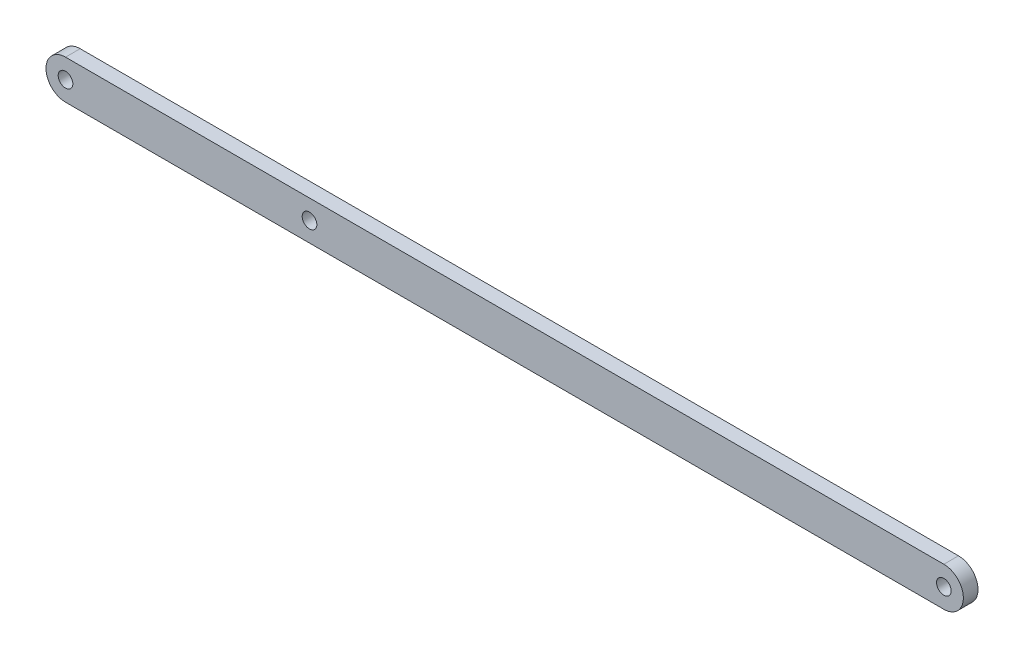
ISO-10303-21;
HEADER;
FILE_DESCRIPTION(('STEP AP214'),'2;1');
FILE_NAME('part.step','',(''),(''),'','','');
FILE_SCHEMA(('AUTOMOTIVE_DESIGN { 1 0 10303 214 1 1 1 1 }'));
ENDSEC;
DATA;
#1=APPLICATION_CONTEXT('core data for automotive mechanical design processes');
#2=APPLICATION_PROTOCOL_DEFINITION('international standard','automotive_design',2000,#1);
#3=PRODUCT_CONTEXT('',#1,'mechanical');
#4=PRODUCT('Part','Part','',(#3));
#5=PRODUCT_RELATED_PRODUCT_CATEGORY('part','',(#4));
#6=PRODUCT_DEFINITION_FORMATION('','',#4);
#7=PRODUCT_DEFINITION_CONTEXT('part definition',#1,'design');
#8=PRODUCT_DEFINITION('design','',#6,#7);
#9=PRODUCT_DEFINITION_SHAPE('','',#8);
#10=(LENGTH_UNIT() NAMED_UNIT(*) SI_UNIT(.MILLI.,.METRE.));
#11=(NAMED_UNIT(*) PLANE_ANGLE_UNIT() SI_UNIT($,.RADIAN.));
#12=(NAMED_UNIT(*) SI_UNIT($,.STERADIAN.) SOLID_ANGLE_UNIT());
#13=UNCERTAINTY_MEASURE_WITH_UNIT(LENGTH_MEASURE(1.E-05),#10,'distance_accuracy_value','');
#14=(GEOMETRIC_REPRESENTATION_CONTEXT(3) GLOBAL_UNCERTAINTY_ASSIGNED_CONTEXT((#13)) GLOBAL_UNIT_ASSIGNED_CONTEXT((#10,
#11,#12)) REPRESENTATION_CONTEXT('',''));
#15=CARTESIAN_POINT('',(0.,0.,0.));
#16=DIRECTION('',(0.,0.,1.));
#17=DIRECTION('',(1.,0.,0.));
#18=AXIS2_PLACEMENT_3D('',#15,#16,#17);
#19=CARTESIAN_POINT('',(-89.8075344843675,0.,-4.5));
#20=DIRECTION('',(0.,0.,1.));
#21=DIRECTION('',(1.,0.,0.));
#22=AXIS2_PLACEMENT_3D('',#19,#20,#21);
#23=CYLINDRICAL_SURFACE('',#22,4.);
#24=CARTESIAN_POINT('',(-89.8075344843675,0.,-1.5));
#25=DIRECTION('',(0.,0.,1.));
#26=DIRECTION('',(1.,0.,0.));
#27=AXIS2_PLACEMENT_3D('',#24,#25,#26);
#28=CIRCLE('',#27,4.);
#29=CARTESIAN_POINT('',(-89.8075344843675,4.00000000000002,-1.5));
#30=VERTEX_POINT('',#29);
#31=CARTESIAN_POINT('',(-89.8075344843675,-3.99999999999998,-1.5));
#32=VERTEX_POINT('',#31);
#33=EDGE_CURVE('E100',#30,#32,#28,.T.);
#34=ORIENTED_EDGE('',*,*,#33,.F.);
#35=DIRECTION('',(0.,0.,1.));
#36=VECTOR('',#35,1.);
#37=CARTESIAN_POINT('',(-89.8075344843675,4.00000000000002,-4.5));
#38=LINE('',#37,#36);
#39=CARTESIAN_POINT('',(-89.8075344843675,4.00000000000002,-4.5));
#40=VERTEX_POINT('',#39);
#41=EDGE_CURVE('E11',#40,#30,#38,.T.);
#42=ORIENTED_EDGE('',*,*,#41,.F.);
#43=CARTESIAN_POINT('',(-89.8075344843675,0.,-4.5));
#44=DIRECTION('',(0.,0.,1.));
#45=DIRECTION('',(1.,0.,0.));
#46=AXIS2_PLACEMENT_3D('',#43,#44,#45);
#47=CIRCLE('',#46,4.);
#48=CARTESIAN_POINT('',(-89.8075344843675,-3.99999999999998,-4.5));
#49=VERTEX_POINT('',#48);
#50=EDGE_CURVE('E93',#40,#49,#47,.T.);
#51=ORIENTED_EDGE('',*,*,#50,.T.);
#52=DIRECTION('',(0.,0.,1.));
#53=VECTOR('',#52,1.);
#54=CARTESIAN_POINT('',(-89.8075344843675,-3.99999999999998,-4.5));
#55=LINE('',#54,#53);
#56=EDGE_CURVE('E38',#49,#32,#55,.T.);
#57=ORIENTED_EDGE('',*,*,#56,.T.);
#58=EDGE_LOOP('',(#34,#42,#51,#57));
#59=FACE_BOUND('',#58,.T.);
#60=ADVANCED_FACE('F35',(#59),#23,.T.);
#61=CARTESIAN_POINT('',(-89.8075344843675,4.00000000000002,-4.5));
#62=DIRECTION('',(0.,1.,0.));
#63=DIRECTION('',(-1.,0.,0.));
#64=AXIS2_PLACEMENT_3D('',#61,#62,#63);
#65=PLANE('',#64);
#66=DIRECTION('',(-1.,0.,0.));
#67=VECTOR('',#66,1.);
#68=CARTESIAN_POINT('',(-89.8075344843675,4.00000000000002,-1.5));
#69=LINE('',#68,#67);
#70=CARTESIAN_POINT('',(90.1924655156325,4.00000000000005,-1.5));
#71=VERTEX_POINT('',#70);
#72=EDGE_CURVE('E95',#71,#30,#69,.T.);
#73=ORIENTED_EDGE('',*,*,#72,.F.);
#74=DIRECTION('',(0.,0.,1.));
#75=VECTOR('',#74,1.);
#76=CARTESIAN_POINT('',(90.1924655156325,4.00000000000005,-4.5));
#77=LINE('',#76,#75);
#78=CARTESIAN_POINT('',(90.1924655156325,4.00000000000005,-4.5));
#79=VERTEX_POINT('',#78);
#80=EDGE_CURVE('E44',#79,#71,#77,.T.);
#81=ORIENTED_EDGE('',*,*,#80,.F.);
#82=DIRECTION('',(-1.,0.,0.));
#83=VECTOR('',#82,1.);
#84=CARTESIAN_POINT('',(-89.8075344843675,4.00000000000002,-4.5));
#85=LINE('',#84,#83);
#86=EDGE_CURVE('E90',#79,#40,#85,.T.);
#87=ORIENTED_EDGE('',*,*,#86,.T.);
#88=ORIENTED_EDGE('',*,*,#41,.T.);
#89=EDGE_LOOP('',(#73,#81,#87,#88));
#90=FACE_BOUND('',#89,.T.);
#91=ADVANCED_FACE('F111',(#90),#65,.T.);
#92=CARTESIAN_POINT('',(90.1924655156325,0.,-4.5));
#93=DIRECTION('',(0.,0.,1.));
#94=DIRECTION('',(1.,0.,0.));
#95=AXIS2_PLACEMENT_3D('',#92,#93,#94);
#96=CYLINDRICAL_SURFACE('',#95,4.);
#97=CARTESIAN_POINT('',(90.1924655156325,0.,-1.5));
#98=DIRECTION('',(0.,0.,1.));
#99=DIRECTION('',(1.,0.,0.));
#100=AXIS2_PLACEMENT_3D('',#97,#98,#99);
#101=CIRCLE('',#100,4.);
#102=CARTESIAN_POINT('',(90.1924655156325,-3.99999999999995,-1.5));
#103=VERTEX_POINT('',#102);
#104=EDGE_CURVE('E85',#103,#71,#101,.T.);
#105=ORIENTED_EDGE('',*,*,#104,.F.);
#106=DIRECTION('',(0.,0.,1.));
#107=VECTOR('',#106,1.);
#108=CARTESIAN_POINT('',(90.1924655156325,-3.99999999999995,-4.5));
#109=LINE('',#108,#107);
#110=CARTESIAN_POINT('',(90.1924655156325,-3.99999999999995,-4.5));
#111=VERTEX_POINT('',#110);
#112=EDGE_CURVE('E80',#111,#103,#109,.T.);
#113=ORIENTED_EDGE('',*,*,#112,.F.);
#114=CARTESIAN_POINT('',(90.1924655156325,0.,-4.5));
#115=DIRECTION('',(0.,0.,1.));
#116=DIRECTION('',(1.,0.,0.));
#117=AXIS2_PLACEMENT_3D('',#114,#115,#116);
#118=CIRCLE('',#117,4.);
#119=EDGE_CURVE('E83',#111,#79,#118,.T.);
#120=ORIENTED_EDGE('',*,*,#119,.T.);
#121=ORIENTED_EDGE('',*,*,#80,.T.);
#122=EDGE_LOOP('',(#105,#113,#120,#121));
#123=FACE_BOUND('',#122,.T.);
#124=ADVANCED_FACE('F82',(#123),#96,.T.);
#125=CARTESIAN_POINT('',(-89.8075344843675,-3.99999999999998,-4.5));
#126=DIRECTION('',(0.,-1.,0.));
#127=DIRECTION('',(1.,0.,0.));
#128=AXIS2_PLACEMENT_3D('',#125,#126,#127);
#129=PLANE('',#128);
#130=DIRECTION('',(1.,0.,0.));
#131=VECTOR('',#130,1.);
#132=CARTESIAN_POINT('',(-89.8075344843675,-3.99999999999998,-1.5));
#133=LINE('',#132,#131);
#134=EDGE_CURVE('E103',#32,#103,#133,.T.);
#135=ORIENTED_EDGE('',*,*,#134,.F.);
#136=ORIENTED_EDGE('',*,*,#56,.F.);
#137=DIRECTION('',(1.,0.,0.));
#138=VECTOR('',#137,1.);
#139=CARTESIAN_POINT('',(-89.8075344843675,-3.99999999999998,-4.5));
#140=LINE('',#139,#138);
#141=EDGE_CURVE('E89',#49,#111,#140,.T.);
#142=ORIENTED_EDGE('',*,*,#141,.T.);
#143=ORIENTED_EDGE('',*,*,#112,.T.);
#144=EDGE_LOOP('',(#135,#136,#142,#143));
#145=FACE_BOUND('',#144,.T.);
#146=ADVANCED_FACE('F92',(#145),#129,.T.);
#147=CARTESIAN_POINT('',(-89.8075344843675,0.,-4.5));
#148=DIRECTION('',(0.,0.,1.));
#149=DIRECTION('',(1.,0.,0.));
#150=AXIS2_PLACEMENT_3D('',#147,#148,#149);
#151=PLANE('',#150);
#152=CARTESIAN_POINT('',(90.1924655156325,0.,-4.5));
#153=DIRECTION('',(0.,0.,1.));
#154=DIRECTION('',(1.,0.,0.));
#155=AXIS2_PLACEMENT_3D('',#152,#153,#154);
#156=CIRCLE('',#155,1.5);
#157=CARTESIAN_POINT('',(91.6924655156325,0.,-4.5));
#158=VERTEX_POINT('',#157);
#159=EDGE_CURVE('E148',#158,#158,#156,.T.);
#160=ORIENTED_EDGE('',*,*,#159,.T.);
#161=EDGE_LOOP('',(#160));
#162=FACE_BOUND('',#161,.T.);
#163=CARTESIAN_POINT('',(-39.8075344843675,0.,-4.5));
#164=DIRECTION('',(0.,0.,1.));
#165=DIRECTION('',(1.,0.,0.));
#166=AXIS2_PLACEMENT_3D('',#163,#164,#165);
#167=CIRCLE('',#166,1.5);
#168=CARTESIAN_POINT('',(-38.3075344843675,0.,-4.5));
#169=VERTEX_POINT('',#168);
#170=EDGE_CURVE('E156',#169,#169,#167,.T.);
#171=ORIENTED_EDGE('',*,*,#170,.T.);
#172=EDGE_LOOP('',(#171));
#173=FACE_BOUND('',#172,.T.);
#174=CARTESIAN_POINT('',(-89.8075344843675,0.,-4.5));
#175=DIRECTION('',(0.,0.,1.));
#176=DIRECTION('',(1.,0.,0.));
#177=AXIS2_PLACEMENT_3D('',#174,#175,#176);
#178=CIRCLE('',#177,1.5);
#179=CARTESIAN_POINT('',(-88.3075344843675,0.,-4.5));
#180=VERTEX_POINT('',#179);
#181=EDGE_CURVE('E104',#180,#180,#178,.T.);
#182=ORIENTED_EDGE('',*,*,#181,.T.);
#183=EDGE_LOOP('',(#182));
#184=FACE_BOUND('',#183,.T.);
#185=ORIENTED_EDGE('',*,*,#50,.F.);
#186=ORIENTED_EDGE('',*,*,#86,.F.);
#187=ORIENTED_EDGE('',*,*,#119,.F.);
#188=ORIENTED_EDGE('',*,*,#141,.F.);
#189=EDGE_LOOP('',(#185,#186,#187,#188));
#190=FACE_BOUND('',#189,.T.);
#191=ADVANCED_FACE('F88',(#162,#173,#184,#190),#151,.F.);
#192=CARTESIAN_POINT('',(-89.8075344843675,0.,-1.5));
#193=DIRECTION('',(0.,0.,1.));
#194=DIRECTION('',(1.,0.,0.));
#195=AXIS2_PLACEMENT_3D('',#192,#193,#194);
#196=PLANE('',#195);
#197=CARTESIAN_POINT('',(90.1924655156325,0.,-1.5));
#198=DIRECTION('',(0.,0.,1.));
#199=DIRECTION('',(1.,0.,0.));
#200=AXIS2_PLACEMENT_3D('',#197,#198,#199);
#201=CIRCLE('',#200,1.5);
#202=CARTESIAN_POINT('',(91.6924655156325,0.,-1.5));
#203=VERTEX_POINT('',#202);
#204=EDGE_CURVE('E151',#203,#203,#201,.T.);
#205=ORIENTED_EDGE('',*,*,#204,.F.);
#206=EDGE_LOOP('',(#205));
#207=FACE_BOUND('',#206,.T.);
#208=CARTESIAN_POINT('',(-39.8075344843675,0.,-1.5));
#209=DIRECTION('',(0.,0.,1.));
#210=DIRECTION('',(1.,0.,0.));
#211=AXIS2_PLACEMENT_3D('',#208,#209,#210);
#212=CIRCLE('',#211,1.5);
#213=CARTESIAN_POINT('',(-38.3075344843675,0.,-1.5));
#214=VERTEX_POINT('',#213);
#215=EDGE_CURVE('E153',#214,#214,#212,.T.);
#216=ORIENTED_EDGE('',*,*,#215,.F.);
#217=EDGE_LOOP('',(#216));
#218=FACE_BOUND('',#217,.T.);
#219=CARTESIAN_POINT('',(-89.8075344843675,0.,-1.5));
#220=DIRECTION('',(0.,0.,1.));
#221=DIRECTION('',(1.,0.,0.));
#222=AXIS2_PLACEMENT_3D('',#219,#220,#221);
#223=CIRCLE('',#222,1.5);
#224=CARTESIAN_POINT('',(-88.3075344843675,0.,-1.5));
#225=VERTEX_POINT('',#224);
#226=EDGE_CURVE('E159',#225,#225,#223,.T.);
#227=ORIENTED_EDGE('',*,*,#226,.F.);
#228=EDGE_LOOP('',(#227));
#229=FACE_BOUND('',#228,.T.);
#230=ORIENTED_EDGE('',*,*,#33,.T.);
#231=ORIENTED_EDGE('',*,*,#134,.T.);
#232=ORIENTED_EDGE('',*,*,#104,.T.);
#233=ORIENTED_EDGE('',*,*,#72,.T.);
#234=EDGE_LOOP('',(#230,#231,#232,#233));
#235=FACE_BOUND('',#234,.T.);
#236=ADVANCED_FACE('F110',(#207,#218,#229,#235),#196,.T.);
#237=CARTESIAN_POINT('',(-89.8075344843675,0.,-4.5));
#238=DIRECTION('',(0.,0.,1.));
#239=DIRECTION('',(1.,0.,0.));
#240=AXIS2_PLACEMENT_3D('',#237,#238,#239);
#241=CYLINDRICAL_SURFACE('',#240,1.5);
#242=ORIENTED_EDGE('',*,*,#181,.F.);
#243=EDGE_LOOP('',(#242));
#244=FACE_BOUND('',#243,.T.);
#245=ORIENTED_EDGE('',*,*,#226,.T.);
#246=EDGE_LOOP('',(#245));
#247=FACE_BOUND('',#246,.T.);
#248=ADVANCED_FACE('F129',(#244,#247),#241,.F.);
#249=CARTESIAN_POINT('',(-39.8075344843675,0.,-4.5));
#250=DIRECTION('',(0.,0.,1.));
#251=DIRECTION('',(1.,0.,0.));
#252=AXIS2_PLACEMENT_3D('',#249,#250,#251);
#253=CYLINDRICAL_SURFACE('',#252,1.5);
#254=ORIENTED_EDGE('',*,*,#170,.F.);
#255=EDGE_LOOP('',(#254));
#256=FACE_BOUND('',#255,.T.);
#257=ORIENTED_EDGE('',*,*,#215,.T.);
#258=EDGE_LOOP('',(#257));
#259=FACE_BOUND('',#258,.T.);
#260=ADVANCED_FACE('F136',(#256,#259),#253,.F.);
#261=CARTESIAN_POINT('',(90.1924655156325,0.,-4.5));
#262=DIRECTION('',(0.,0.,1.));
#263=DIRECTION('',(1.,0.,0.));
#264=AXIS2_PLACEMENT_3D('',#261,#262,#263);
#265=CYLINDRICAL_SURFACE('',#264,1.5);
#266=ORIENTED_EDGE('',*,*,#159,.F.);
#267=EDGE_LOOP('',(#266));
#268=FACE_BOUND('',#267,.T.);
#269=ORIENTED_EDGE('',*,*,#204,.T.);
#270=EDGE_LOOP('',(#269));
#271=FACE_BOUND('',#270,.T.);
#272=ADVANCED_FACE('F140',(#268,#271),#265,.F.);
#273=CLOSED_SHELL('',(#60,#91,#124,#146,#191,#236,#248,#260,#272));
#274=MANIFOLD_SOLID_BREP('B2',#273);
#275=ADVANCED_BREP_SHAPE_REPRESENTATION('',(#18,#274),#14);
#276=SHAPE_DEFINITION_REPRESENTATION(#9,#275);
ENDSEC;
END-ISO-10303-21;
